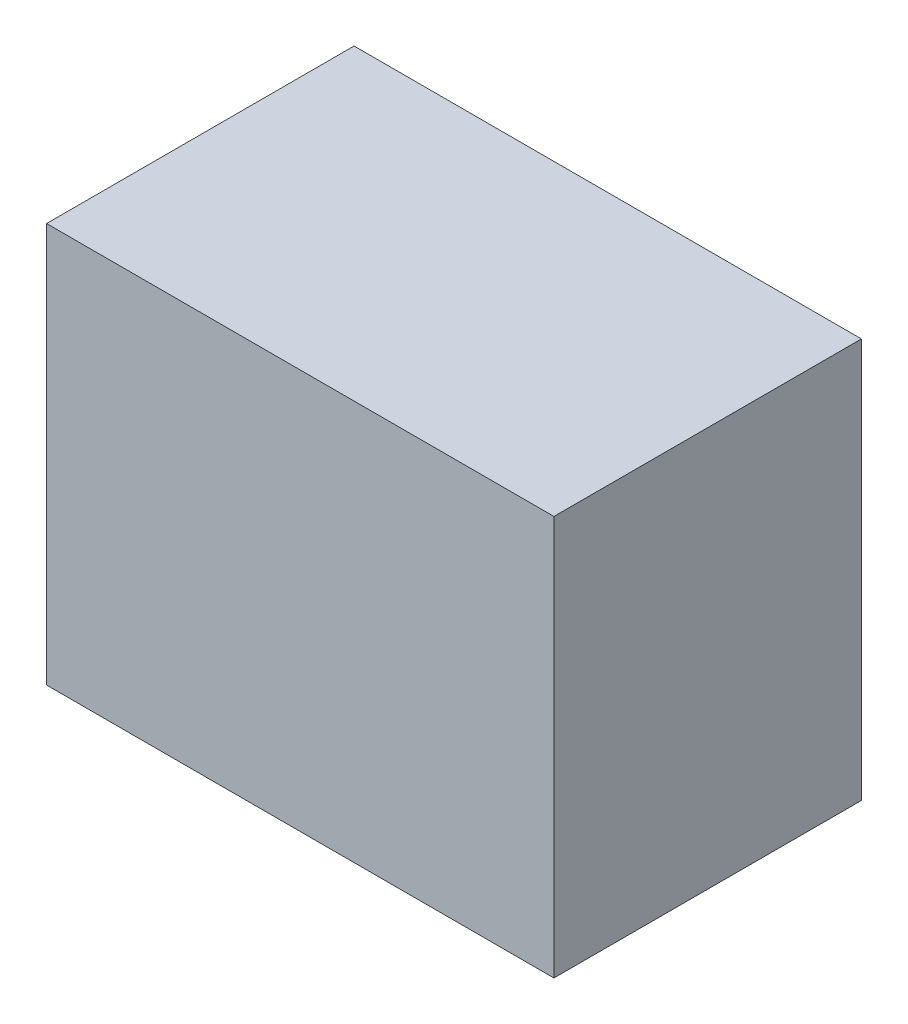
ISO-10303-21;
HEADER;
FILE_DESCRIPTION(('STEP AP214'),'2;1');
FILE_NAME('part.step','',(''),(''),'','','');
FILE_SCHEMA(('AUTOMOTIVE_DESIGN { 1 0 10303 214 1 1 1 1 }'));
ENDSEC;
DATA;
#1=APPLICATION_CONTEXT('core data for automotive mechanical design processes');
#2=APPLICATION_PROTOCOL_DEFINITION('international standard','automotive_design',2000,#1);
#3=PRODUCT_CONTEXT('',#1,'mechanical');
#4=PRODUCT('Part','Part','',(#3));
#5=PRODUCT_RELATED_PRODUCT_CATEGORY('part','',(#4));
#6=PRODUCT_DEFINITION_FORMATION('','',#4);
#7=PRODUCT_DEFINITION_CONTEXT('part definition',#1,'design');
#8=PRODUCT_DEFINITION('design','',#6,#7);
#9=PRODUCT_DEFINITION_SHAPE('','',#8);
#10=(LENGTH_UNIT() NAMED_UNIT(*) SI_UNIT(.MILLI.,.METRE.));
#11=(NAMED_UNIT(*) PLANE_ANGLE_UNIT() SI_UNIT($,.RADIAN.));
#12=(NAMED_UNIT(*) SI_UNIT($,.STERADIAN.) SOLID_ANGLE_UNIT());
#13=UNCERTAINTY_MEASURE_WITH_UNIT(LENGTH_MEASURE(1.E-05),#10,'distance_accuracy_value','');
#14=(GEOMETRIC_REPRESENTATION_CONTEXT(3) GLOBAL_UNCERTAINTY_ASSIGNED_CONTEXT((#13)) GLOBAL_UNIT_ASSIGNED_CONTEXT((#10,
#11,#12)) REPRESENTATION_CONTEXT('',''));
#15=CARTESIAN_POINT('',(0.,0.,0.));
#16=DIRECTION('',(0.,0.,1.));
#17=DIRECTION('',(1.,0.,0.));
#18=AXIS2_PLACEMENT_3D('',#15,#16,#17);
#19=CARTESIAN_POINT('',(-8.25000000000001,6.50000000000001,10.));
#20=DIRECTION('',(1.,0.,0.));
#21=DIRECTION('',(0.,0.,-1.));
#22=AXIS2_PLACEMENT_3D('',#19,#20,#21);
#23=PLANE('',#22);
#24=DIRECTION('',(0.,-1.,0.));
#25=VECTOR('',#24,1.);
#26=CARTESIAN_POINT('',(-8.25000000000001,6.50000000000001,0.));
#27=LINE('',#26,#25);
#28=CARTESIAN_POINT('',(-8.25000000000001,6.50000000000001,0.));
#29=VERTEX_POINT('',#28);
#30=CARTESIAN_POINT('',(-8.25000000000001,-6.5,0.));
#31=VERTEX_POINT('',#30);
#32=EDGE_CURVE('E96',#29,#31,#27,.T.);
#33=ORIENTED_EDGE('',*,*,#32,.T.);
#34=DIRECTION('',(0.,0.,-1.));
#35=VECTOR('',#34,1.);
#36=CARTESIAN_POINT('',(-8.25000000000001,-6.5,10.));
#37=LINE('',#36,#35);
#38=CARTESIAN_POINT('',(-8.25000000000001,-6.5,10.));
#39=VERTEX_POINT('',#38);
#40=EDGE_CURVE('E11',#39,#31,#37,.T.);
#41=ORIENTED_EDGE('',*,*,#40,.F.);
#42=DIRECTION('',(0.,-1.,0.));
#43=VECTOR('',#42,1.);
#44=CARTESIAN_POINT('',(-8.25000000000001,6.50000000000001,10.));
#45=LINE('',#44,#43);
#46=CARTESIAN_POINT('',(-8.25000000000001,6.50000000000001,10.));
#47=VERTEX_POINT('',#46);
#48=EDGE_CURVE('E84',#47,#39,#45,.T.);
#49=ORIENTED_EDGE('',*,*,#48,.F.);
#50=DIRECTION('',(0.,0.,-1.));
#51=VECTOR('',#50,1.);
#52=CARTESIAN_POINT('',(-8.25000000000001,6.50000000000001,10.));
#53=LINE('',#52,#51);
#54=EDGE_CURVE('E92',#47,#29,#53,.T.);
#55=ORIENTED_EDGE('',*,*,#54,.T.);
#56=EDGE_LOOP('',(#33,#41,#49,#55));
#57=FACE_BOUND('',#56,.T.);
#58=ADVANCED_FACE('F33',(#57),#23,.F.);
#59=CARTESIAN_POINT('',(-8.25000000000001,-6.5,10.));
#60=DIRECTION('',(0.,1.,0.));
#61=DIRECTION('',(0.,0.,1.));
#62=AXIS2_PLACEMENT_3D('',#59,#60,#61);
#63=PLANE('',#62);
#64=DIRECTION('',(1.,0.,0.));
#65=VECTOR('',#64,1.);
#66=CARTESIAN_POINT('',(-8.25000000000001,-6.5,0.));
#67=LINE('',#66,#65);
#68=CARTESIAN_POINT('',(8.25000000000001,-6.5,0.));
#69=VERTEX_POINT('',#68);
#70=EDGE_CURVE('E88',#31,#69,#67,.T.);
#71=ORIENTED_EDGE('',*,*,#70,.T.);
#72=DIRECTION('',(0.,0.,-1.));
#73=VECTOR('',#72,1.);
#74=CARTESIAN_POINT('',(8.25000000000001,-6.5,10.));
#75=LINE('',#74,#73);
#76=CARTESIAN_POINT('',(8.25000000000001,-6.5,10.));
#77=VERTEX_POINT('',#76);
#78=EDGE_CURVE('E41',#77,#69,#75,.T.);
#79=ORIENTED_EDGE('',*,*,#78,.F.);
#80=DIRECTION('',(1.,0.,0.));
#81=VECTOR('',#80,1.);
#82=CARTESIAN_POINT('',(-8.25000000000001,-6.5,10.));
#83=LINE('',#82,#81);
#84=EDGE_CURVE('E79',#39,#77,#83,.T.);
#85=ORIENTED_EDGE('',*,*,#84,.F.);
#86=ORIENTED_EDGE('',*,*,#40,.T.);
#87=EDGE_LOOP('',(#71,#79,#85,#86));
#88=FACE_BOUND('',#87,.T.);
#89=ADVANCED_FACE('F87',(#88),#63,.F.);
#90=CARTESIAN_POINT('',(8.25000000000001,6.50000000000001,10.));
#91=DIRECTION('',(-1.,0.,0.));
#92=DIRECTION('',(0.,0.,1.));
#93=AXIS2_PLACEMENT_3D('',#90,#91,#92);
#94=PLANE('',#93);
#95=DIRECTION('',(0.,1.,0.));
#96=VECTOR('',#95,1.);
#97=CARTESIAN_POINT('',(8.25000000000001,6.50000000000001,0.));
#98=LINE('',#97,#96);
#99=CARTESIAN_POINT('',(8.25000000000001,6.50000000000001,0.));
#100=VERTEX_POINT('',#99);
#101=EDGE_CURVE('E66',#69,#100,#98,.T.);
#102=ORIENTED_EDGE('',*,*,#101,.T.);
#103=DIRECTION('',(0.,0.,-1.));
#104=VECTOR('',#103,1.);
#105=CARTESIAN_POINT('',(8.25000000000001,6.50000000000001,10.));
#106=LINE('',#105,#104);
#107=CARTESIAN_POINT('',(8.25000000000001,6.50000000000001,10.));
#108=VERTEX_POINT('',#107);
#109=EDGE_CURVE('E89',#108,#100,#106,.T.);
#110=ORIENTED_EDGE('',*,*,#109,.F.);
#111=DIRECTION('',(0.,1.,0.));
#112=VECTOR('',#111,1.);
#113=CARTESIAN_POINT('',(8.25000000000001,6.50000000000001,10.));
#114=LINE('',#113,#112);
#115=EDGE_CURVE('E82',#77,#108,#114,.T.);
#116=ORIENTED_EDGE('',*,*,#115,.F.);
#117=ORIENTED_EDGE('',*,*,#78,.T.);
#118=EDGE_LOOP('',(#102,#110,#116,#117));
#119=FACE_BOUND('',#118,.T.);
#120=ADVANCED_FACE('F90',(#119),#94,.F.);
#121=CARTESIAN_POINT('',(-8.25000000000001,6.50000000000001,10.));
#122=DIRECTION('',(0.,-1.,0.));
#123=DIRECTION('',(0.,0.,-1.));
#124=AXIS2_PLACEMENT_3D('',#121,#122,#123);
#125=PLANE('',#124);
#126=DIRECTION('',(-1.,0.,0.));
#127=VECTOR('',#126,1.);
#128=CARTESIAN_POINT('',(-8.25000000000001,6.50000000000001,0.));
#129=LINE('',#128,#127);
#130=EDGE_CURVE('E72',#100,#29,#129,.T.);
#131=ORIENTED_EDGE('',*,*,#130,.T.);
#132=ORIENTED_EDGE('',*,*,#54,.F.);
#133=DIRECTION('',(-1.,0.,0.));
#134=VECTOR('',#133,1.);
#135=CARTESIAN_POINT('',(-8.25000000000001,6.50000000000001,10.));
#136=LINE('',#135,#134);
#137=EDGE_CURVE('E49',#108,#47,#136,.T.);
#138=ORIENTED_EDGE('',*,*,#137,.F.);
#139=ORIENTED_EDGE('',*,*,#109,.T.);
#140=EDGE_LOOP('',(#131,#132,#138,#139));
#141=FACE_BOUND('',#140,.T.);
#142=ADVANCED_FACE('F103',(#141),#125,.F.);
#143=CARTESIAN_POINT('',(0.,0.,10.));
#144=DIRECTION('',(0.,0.,1.));
#145=DIRECTION('',(1.,0.,0.));
#146=AXIS2_PLACEMENT_3D('',#143,#144,#145);
#147=PLANE('',#146);
#148=ORIENTED_EDGE('',*,*,#48,.T.);
#149=ORIENTED_EDGE('',*,*,#84,.T.);
#150=ORIENTED_EDGE('',*,*,#115,.T.);
#151=ORIENTED_EDGE('',*,*,#137,.T.);
#152=EDGE_LOOP('',(#148,#149,#150,#151));
#153=FACE_BOUND('',#152,.T.);
#154=ADVANCED_FACE('F80',(#153),#147,.T.);
#155=CARTESIAN_POINT('',(0.,0.,0.));
#156=DIRECTION('',(0.,0.,1.));
#157=DIRECTION('',(1.,0.,0.));
#158=AXIS2_PLACEMENT_3D('',#155,#156,#157);
#159=PLANE('',#158);
#160=ORIENTED_EDGE('',*,*,#32,.F.);
#161=ORIENTED_EDGE('',*,*,#130,.F.);
#162=ORIENTED_EDGE('',*,*,#101,.F.);
#163=ORIENTED_EDGE('',*,*,#70,.F.);
#164=EDGE_LOOP('',(#160,#161,#162,#163));
#165=FACE_BOUND('',#164,.T.);
#166=ADVANCED_FACE('F106',(#165),#159,.F.);
#167=CLOSED_SHELL('',(#58,#89,#120,#142,#154,#166));
#168=MANIFOLD_SOLID_BREP('B2',#167);
#169=ADVANCED_BREP_SHAPE_REPRESENTATION('',(#18,#168),#14);
#170=SHAPE_DEFINITION_REPRESENTATION(#9,#169);
ENDSEC;
END-ISO-10303-21;
